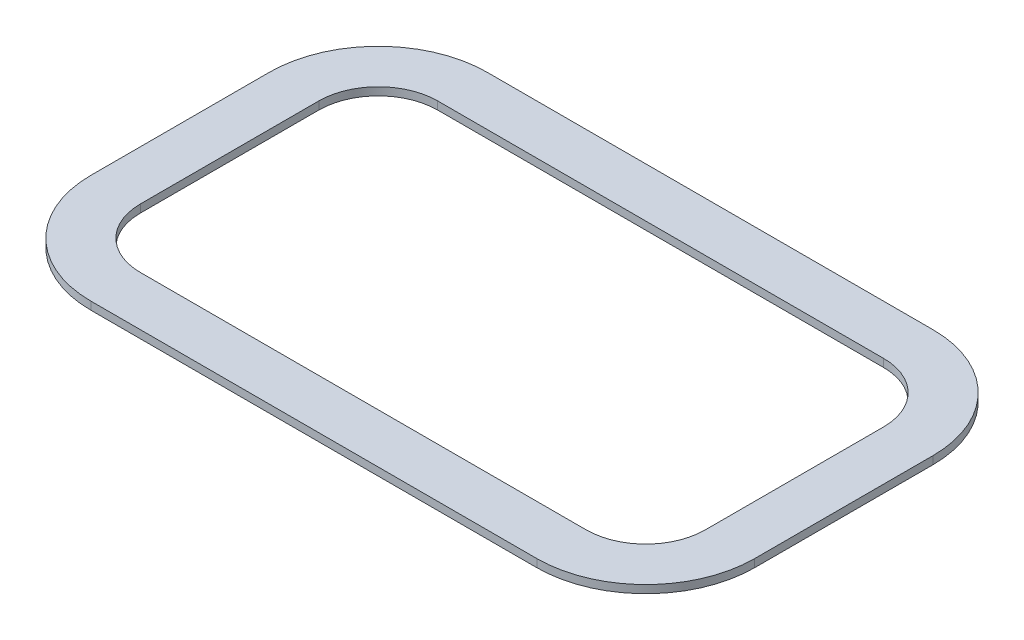
ISO-10303-21;
HEADER;
FILE_DESCRIPTION(('STEP AP214'),'2;1');
FILE_NAME('part.step','',(''),(''),'','','');
FILE_SCHEMA(('AUTOMOTIVE_DESIGN { 1 0 10303 214 1 1 1 1 }'));
ENDSEC;
DATA;
#1=APPLICATION_CONTEXT('core data for automotive mechanical design processes');
#2=APPLICATION_PROTOCOL_DEFINITION('international standard','automotive_design',2000,#1);
#3=PRODUCT_CONTEXT('',#1,'mechanical');
#4=PRODUCT('Part','Part','',(#3));
#5=PRODUCT_RELATED_PRODUCT_CATEGORY('part','',(#4));
#6=PRODUCT_DEFINITION_FORMATION('','',#4);
#7=PRODUCT_DEFINITION_CONTEXT('part definition',#1,'design');
#8=PRODUCT_DEFINITION('design','',#6,#7);
#9=PRODUCT_DEFINITION_SHAPE('','',#8);
#10=(LENGTH_UNIT() NAMED_UNIT(*) SI_UNIT(.MILLI.,.METRE.));
#11=(NAMED_UNIT(*) PLANE_ANGLE_UNIT() SI_UNIT($,.RADIAN.));
#12=(NAMED_UNIT(*) SI_UNIT($,.STERADIAN.) SOLID_ANGLE_UNIT());
#13=UNCERTAINTY_MEASURE_WITH_UNIT(LENGTH_MEASURE(1.E-05),#10,'distance_accuracy_value','');
#14=(GEOMETRIC_REPRESENTATION_CONTEXT(3) GLOBAL_UNCERTAINTY_ASSIGNED_CONTEXT((#13)) GLOBAL_UNIT_ASSIGNED_CONTEXT((#10,
#11,#12)) REPRESENTATION_CONTEXT('',''));
#15=CARTESIAN_POINT('',(0.,0.,0.));
#16=DIRECTION('',(0.,0.,1.));
#17=DIRECTION('',(1.,0.,0.));
#18=AXIS2_PLACEMENT_3D('',#15,#16,#17);
#19=CARTESIAN_POINT('',(55.,4.,-55.));
#20=DIRECTION('',(0.,-1.,0.));
#21=DIRECTION('',(0.,0.,-1.));
#22=AXIS2_PLACEMENT_3D('',#19,#20,#21);
#23=PLANE('',#22);
#24=CARTESIAN_POINT('',(55.,4.,-55.));
#25=DIRECTION('',(0.,1.,0.));
#26=DIRECTION('',(0.,0.,-1.));
#27=AXIS2_PLACEMENT_3D('',#24,#25,#26);
#28=CIRCLE('',#27,55.);
#29=CARTESIAN_POINT('',(0.,4.,-55.0000000000004));
#30=VERTEX_POINT('',#29);
#31=CARTESIAN_POINT('',(55.0000000000004,4.,0.));
#32=VERTEX_POINT('',#31);
#33=EDGE_CURVE('E213',#30,#32,#28,.T.);
#34=ORIENTED_EDGE('',*,*,#33,.T.);
#35=DIRECTION('',(1.,0.,0.));
#36=VECTOR('',#35,1.);
#37=CARTESIAN_POINT('',(55.0000000000004,4.,0.));
#38=LINE('',#37,#36);
#39=CARTESIAN_POINT('',(280.,4.,0.));
#40=VERTEX_POINT('',#39);
#41=EDGE_CURVE('E216',#32,#40,#38,.T.);
#42=ORIENTED_EDGE('',*,*,#41,.T.);
#43=CARTESIAN_POINT('',(280.,4.,-55.));
#44=DIRECTION('',(0.,1.,0.));
#45=DIRECTION('',(0.,0.,1.));
#46=AXIS2_PLACEMENT_3D('',#43,#44,#45);
#47=CIRCLE('',#46,55.);
#48=CARTESIAN_POINT('',(335.,4.,-55.0000000000004));
#49=VERTEX_POINT('',#48);
#50=EDGE_CURVE('E219',#40,#49,#47,.T.);
#51=ORIENTED_EDGE('',*,*,#50,.T.);
#52=DIRECTION('',(0.,0.,-1.));
#53=VECTOR('',#52,1.);
#54=CARTESIAN_POINT('',(335.,4.,-55.0000000000004));
#55=LINE('',#54,#53);
#56=CARTESIAN_POINT('',(335.,4.,-145.));
#57=VERTEX_POINT('',#56);
#58=EDGE_CURVE('E221',#49,#57,#55,.T.);
#59=ORIENTED_EDGE('',*,*,#58,.T.);
#60=CARTESIAN_POINT('',(280.,4.,-145.));
#61=DIRECTION('',(0.,1.,0.));
#62=DIRECTION('',(0.,0.,-1.));
#63=AXIS2_PLACEMENT_3D('',#60,#61,#62);
#64=CIRCLE('',#63,55.);
#65=CARTESIAN_POINT('',(280.,4.,-200.));
#66=VERTEX_POINT('',#65);
#67=EDGE_CURVE('E223',#57,#66,#64,.T.);
#68=ORIENTED_EDGE('',*,*,#67,.T.);
#69=DIRECTION('',(-1.,0.,0.));
#70=VECTOR('',#69,1.);
#71=CARTESIAN_POINT('',(55.0000000000004,4.,-200.));
#72=LINE('',#71,#70);
#73=CARTESIAN_POINT('',(55.0000000000004,4.,-200.));
#74=VERTEX_POINT('',#73);
#75=EDGE_CURVE('E225',#66,#74,#72,.T.);
#76=ORIENTED_EDGE('',*,*,#75,.T.);
#77=CARTESIAN_POINT('',(55.,4.,-145.));
#78=DIRECTION('',(0.,1.,0.));
#79=DIRECTION('',(0.,0.,-1.));
#80=AXIS2_PLACEMENT_3D('',#77,#78,#79);
#81=CIRCLE('',#80,55.);
#82=CARTESIAN_POINT('',(0.,4.,-145.));
#83=VERTEX_POINT('',#82);
#84=EDGE_CURVE('E227',#74,#83,#81,.T.);
#85=ORIENTED_EDGE('',*,*,#84,.T.);
#86=DIRECTION('',(0.,0.,1.));
#87=VECTOR('',#86,1.);
#88=CARTESIAN_POINT('',(0.,4.,-55.0000000000004));
#89=LINE('',#88,#87);
#90=EDGE_CURVE('E229',#83,#30,#89,.T.);
#91=ORIENTED_EDGE('',*,*,#90,.T.);
#92=EDGE_LOOP('',(#34,#42,#51,#59,#68,#76,#85,#91));
#93=FACE_BOUND('',#92,.T.);
#94=CARTESIAN_POINT('',(55.,4.,-55.));
#95=DIRECTION('',(0.,1.,0.));
#96=DIRECTION('',(0.,0.,-1.));
#97=AXIS2_PLACEMENT_3D('',#94,#95,#96);
#98=CIRCLE('',#97,30.);
#99=CARTESIAN_POINT('',(25.,4.,-55.0000000000004));
#100=VERTEX_POINT('',#99);
#101=CARTESIAN_POINT('',(55.0000000000004,4.,-25.));
#102=VERTEX_POINT('',#101);
#103=EDGE_CURVE('E148',#100,#102,#98,.T.);
#104=ORIENTED_EDGE('',*,*,#103,.F.);
#105=DIRECTION('',(0.,0.,1.));
#106=VECTOR('',#105,1.);
#107=CARTESIAN_POINT('',(25.,4.,-55.0000000000004));
#108=LINE('',#107,#106);
#109=CARTESIAN_POINT('',(25.,4.,-145.));
#110=VERTEX_POINT('',#109);
#111=EDGE_CURVE('E181',#110,#100,#108,.T.);
#112=ORIENTED_EDGE('',*,*,#111,.F.);
#113=CARTESIAN_POINT('',(55.,4.,-145.));
#114=DIRECTION('',(0.,1.,0.));
#115=DIRECTION('',(0.,0.,-1.));
#116=AXIS2_PLACEMENT_3D('',#113,#114,#115);
#117=CIRCLE('',#116,30.);
#118=CARTESIAN_POINT('',(55.0000000000004,4.,-175.));
#119=VERTEX_POINT('',#118);
#120=EDGE_CURVE('E179',#119,#110,#117,.T.);
#121=ORIENTED_EDGE('',*,*,#120,.F.);
#122=DIRECTION('',(-1.,0.,0.));
#123=VECTOR('',#122,1.);
#124=CARTESIAN_POINT('',(55.0000000000004,4.,-175.));
#125=LINE('',#124,#123);
#126=CARTESIAN_POINT('',(280.,4.,-175.));
#127=VERTEX_POINT('',#126);
#128=EDGE_CURVE('E177',#127,#119,#125,.T.);
#129=ORIENTED_EDGE('',*,*,#128,.F.);
#130=CARTESIAN_POINT('',(280.,4.,-145.));
#131=DIRECTION('',(0.,1.,0.));
#132=DIRECTION('',(0.,0.,-1.));
#133=AXIS2_PLACEMENT_3D('',#130,#131,#132);
#134=CIRCLE('',#133,30.);
#135=CARTESIAN_POINT('',(310.,4.,-145.));
#136=VERTEX_POINT('',#135);
#137=EDGE_CURVE('E175',#136,#127,#134,.T.);
#138=ORIENTED_EDGE('',*,*,#137,.F.);
#139=DIRECTION('',(0.,0.,-1.));
#140=VECTOR('',#139,1.);
#141=CARTESIAN_POINT('',(310.,4.,-55.0000000000002));
#142=LINE('',#141,#140);
#143=CARTESIAN_POINT('',(310.,4.,-55.0000000000002));
#144=VERTEX_POINT('',#143);
#145=EDGE_CURVE('E171',#144,#136,#142,.T.);
#146=ORIENTED_EDGE('',*,*,#145,.F.);
#147=CARTESIAN_POINT('',(280.,4.,-55.));
#148=DIRECTION('',(0.,1.,0.));
#149=DIRECTION('',(0.,0.,1.));
#150=AXIS2_PLACEMENT_3D('',#147,#148,#149);
#151=CIRCLE('',#150,30.);
#152=CARTESIAN_POINT('',(280.,4.,-25.));
#153=VERTEX_POINT('',#152);
#154=EDGE_CURVE('E169',#153,#144,#151,.T.);
#155=ORIENTED_EDGE('',*,*,#154,.F.);
#156=DIRECTION('',(1.,0.,0.));
#157=VECTOR('',#156,1.);
#158=CARTESIAN_POINT('',(55.0000000000004,4.,-25.));
#159=LINE('',#158,#157);
#160=EDGE_CURVE('E156',#102,#153,#159,.T.);
#161=ORIENTED_EDGE('',*,*,#160,.F.);
#162=EDGE_LOOP('',(#104,#112,#121,#129,#138,#146,#155,#161));
#163=FACE_BOUND('',#162,.T.);
#164=ADVANCED_FACE('F35',(#93,#163),#23,.F.);
#165=CARTESIAN_POINT('',(55.,0.,-55.));
#166=DIRECTION('',(0.,-1.,0.));
#167=DIRECTION('',(0.,0.,-1.));
#168=AXIS2_PLACEMENT_3D('',#165,#166,#167);
#169=PLANE('',#168);
#170=CARTESIAN_POINT('',(55.,0.,-55.));
#171=DIRECTION('',(0.,1.,0.));
#172=DIRECTION('',(0.,0.,-1.));
#173=AXIS2_PLACEMENT_3D('',#170,#171,#172);
#174=CIRCLE('',#173,55.);
#175=CARTESIAN_POINT('',(0.,0.,-55.0000000000004));
#176=VERTEX_POINT('',#175);
#177=CARTESIAN_POINT('',(55.0000000000004,0.,0.));
#178=VERTEX_POINT('',#177);
#179=EDGE_CURVE('E164',#176,#178,#174,.T.);
#180=ORIENTED_EDGE('',*,*,#179,.F.);
#181=DIRECTION('',(0.,0.,1.));
#182=VECTOR('',#181,1.);
#183=CARTESIAN_POINT('',(0.,0.,-55.0000000000004));
#184=LINE('',#183,#182);
#185=CARTESIAN_POINT('',(0.,0.,-145.));
#186=VERTEX_POINT('',#185);
#187=EDGE_CURVE('E217',#186,#176,#184,.T.);
#188=ORIENTED_EDGE('',*,*,#187,.F.);
#189=CARTESIAN_POINT('',(55.,0.,-145.));
#190=DIRECTION('',(0.,1.,0.));
#191=DIRECTION('',(0.,0.,-1.));
#192=AXIS2_PLACEMENT_3D('',#189,#190,#191);
#193=CIRCLE('',#192,55.);
#194=CARTESIAN_POINT('',(55.0000000000004,0.,-200.));
#195=VERTEX_POINT('',#194);
#196=EDGE_CURVE('E244',#195,#186,#193,.T.);
#197=ORIENTED_EDGE('',*,*,#196,.F.);
#198=DIRECTION('',(-1.,0.,0.));
#199=VECTOR('',#198,1.);
#200=CARTESIAN_POINT('',(55.0000000000004,0.,-200.));
#201=LINE('',#200,#199);
#202=CARTESIAN_POINT('',(280.,0.,-200.));
#203=VERTEX_POINT('',#202);
#204=EDGE_CURVE('E242',#203,#195,#201,.T.);
#205=ORIENTED_EDGE('',*,*,#204,.F.);
#206=CARTESIAN_POINT('',(280.,0.,-145.));
#207=DIRECTION('',(0.,1.,0.));
#208=DIRECTION('',(0.,0.,-1.));
#209=AXIS2_PLACEMENT_3D('',#206,#207,#208);
#210=CIRCLE('',#209,55.);
#211=CARTESIAN_POINT('',(335.,0.,-145.));
#212=VERTEX_POINT('',#211);
#213=EDGE_CURVE('E240',#212,#203,#210,.T.);
#214=ORIENTED_EDGE('',*,*,#213,.F.);
#215=DIRECTION('',(0.,0.,-1.));
#216=VECTOR('',#215,1.);
#217=CARTESIAN_POINT('',(335.,0.,-55.0000000000004));
#218=LINE('',#217,#216);
#219=CARTESIAN_POINT('',(335.,0.,-55.0000000000004));
#220=VERTEX_POINT('',#219);
#221=EDGE_CURVE('E238',#220,#212,#218,.T.);
#222=ORIENTED_EDGE('',*,*,#221,.F.);
#223=CARTESIAN_POINT('',(280.,0.,-55.));
#224=DIRECTION('',(0.,1.,0.));
#225=DIRECTION('',(0.,0.,1.));
#226=AXIS2_PLACEMENT_3D('',#223,#224,#225);
#227=CIRCLE('',#226,55.);
#228=CARTESIAN_POINT('',(280.,0.,0.));
#229=VERTEX_POINT('',#228);
#230=EDGE_CURVE('E236',#229,#220,#227,.T.);
#231=ORIENTED_EDGE('',*,*,#230,.F.);
#232=DIRECTION('',(1.,0.,0.));
#233=VECTOR('',#232,1.);
#234=CARTESIAN_POINT('',(55.0000000000004,0.,0.));
#235=LINE('',#234,#233);
#236=EDGE_CURVE('E234',#178,#229,#235,.T.);
#237=ORIENTED_EDGE('',*,*,#236,.F.);
#238=EDGE_LOOP('',(#180,#188,#197,#205,#214,#222,#231,#237));
#239=FACE_BOUND('',#238,.T.);
#240=DIRECTION('',(0.,0.,1.));
#241=VECTOR('',#240,1.);
#242=CARTESIAN_POINT('',(25.,0.,-55.0000000000004));
#243=LINE('',#242,#241);
#244=CARTESIAN_POINT('',(25.,0.,-145.));
#245=VERTEX_POINT('',#244);
#246=CARTESIAN_POINT('',(25.,0.,-55.0000000000004));
#247=VERTEX_POINT('',#246);
#248=EDGE_CURVE('E157',#245,#247,#243,.T.);
#249=ORIENTED_EDGE('',*,*,#248,.T.);
#250=CARTESIAN_POINT('',(55.,0.,-55.));
#251=DIRECTION('',(0.,1.,0.));
#252=DIRECTION('',(0.,0.,-1.));
#253=AXIS2_PLACEMENT_3D('',#250,#251,#252);
#254=CIRCLE('',#253,30.);
#255=CARTESIAN_POINT('',(55.0000000000004,0.,-25.));
#256=VERTEX_POINT('',#255);
#257=EDGE_CURVE('E58',#247,#256,#254,.T.);
#258=ORIENTED_EDGE('',*,*,#257,.T.);
#259=DIRECTION('',(1.,0.,0.));
#260=VECTOR('',#259,1.);
#261=CARTESIAN_POINT('',(55.0000000000004,0.,-25.));
#262=LINE('',#261,#260);
#263=CARTESIAN_POINT('',(280.,0.,-25.));
#264=VERTEX_POINT('',#263);
#265=EDGE_CURVE('E163',#256,#264,#262,.T.);
#266=ORIENTED_EDGE('',*,*,#265,.T.);
#267=CARTESIAN_POINT('',(280.,0.,-55.));
#268=DIRECTION('',(0.,1.,0.));
#269=DIRECTION('',(0.,0.,1.));
#270=AXIS2_PLACEMENT_3D('',#267,#268,#269);
#271=CIRCLE('',#270,30.);
#272=CARTESIAN_POINT('',(310.,0.,-55.0000000000002));
#273=VERTEX_POINT('',#272);
#274=EDGE_CURVE('E185',#264,#273,#271,.T.);
#275=ORIENTED_EDGE('',*,*,#274,.T.);
#276=DIRECTION('',(0.,0.,-1.));
#277=VECTOR('',#276,1.);
#278=CARTESIAN_POINT('',(310.,0.,-55.0000000000002));
#279=LINE('',#278,#277);
#280=CARTESIAN_POINT('',(310.,0.,-145.));
#281=VERTEX_POINT('',#280);
#282=EDGE_CURVE('E188',#273,#281,#279,.T.);
#283=ORIENTED_EDGE('',*,*,#282,.T.);
#284=CARTESIAN_POINT('',(280.,0.,-145.));
#285=DIRECTION('',(0.,1.,0.));
#286=DIRECTION('',(0.,0.,-1.));
#287=AXIS2_PLACEMENT_3D('',#284,#285,#286);
#288=CIRCLE('',#287,30.);
#289=CARTESIAN_POINT('',(280.,0.,-175.));
#290=VERTEX_POINT('',#289);
#291=EDGE_CURVE('E191',#281,#290,#288,.T.);
#292=ORIENTED_EDGE('',*,*,#291,.T.);
#293=DIRECTION('',(-1.,0.,0.));
#294=VECTOR('',#293,1.);
#295=CARTESIAN_POINT('',(55.0000000000004,0.,-175.));
#296=LINE('',#295,#294);
#297=CARTESIAN_POINT('',(55.0000000000004,0.,-175.));
#298=VERTEX_POINT('',#297);
#299=EDGE_CURVE('E194',#290,#298,#296,.T.);
#300=ORIENTED_EDGE('',*,*,#299,.T.);
#301=CARTESIAN_POINT('',(55.,0.,-145.));
#302=DIRECTION('',(0.,1.,0.));
#303=DIRECTION('',(0.,0.,-1.));
#304=AXIS2_PLACEMENT_3D('',#301,#302,#303);
#305=CIRCLE('',#304,30.);
#306=EDGE_CURVE('E197',#298,#245,#305,.T.);
#307=ORIENTED_EDGE('',*,*,#306,.T.);
#308=EDGE_LOOP('',(#249,#258,#266,#275,#283,#292,#300,#307));
#309=FACE_BOUND('',#308,.T.);
#310=ADVANCED_FACE('F274',(#239,#309),#169,.T.);
#311=CARTESIAN_POINT('',(55.,4.,-55.));
#312=DIRECTION('',(0.,-1.,0.));
#313=DIRECTION('',(0.,0.,-1.));
#314=AXIS2_PLACEMENT_3D('',#311,#312,#313);
#315=CYLINDRICAL_SURFACE('',#314,55.);
#316=ORIENTED_EDGE('',*,*,#179,.T.);
#317=DIRECTION('',(0.,-1.,0.));
#318=VECTOR('',#317,1.);
#319=CARTESIAN_POINT('',(55.0000000000004,4.,0.));
#320=LINE('',#319,#318);
#321=EDGE_CURVE('E11',#32,#178,#320,.T.);
#322=ORIENTED_EDGE('',*,*,#321,.F.);
#323=ORIENTED_EDGE('',*,*,#33,.F.);
#324=DIRECTION('',(0.,-1.,0.));
#325=VECTOR('',#324,1.);
#326=CARTESIAN_POINT('',(0.,4.,-55.0000000000004));
#327=LINE('',#326,#325);
#328=EDGE_CURVE('E231',#30,#176,#327,.T.);
#329=ORIENTED_EDGE('',*,*,#328,.T.);
#330=EDGE_LOOP('',(#316,#322,#323,#329));
#331=FACE_BOUND('',#330,.T.);
#332=ADVANCED_FACE('F37',(#331),#315,.T.);
#333=CARTESIAN_POINT('',(55.0000000000004,4.,0.));
#334=DIRECTION('',(0.,0.,-1.));
#335=DIRECTION('',(-1.,0.,0.));
#336=AXIS2_PLACEMENT_3D('',#333,#334,#335);
#337=PLANE('',#336);
#338=ORIENTED_EDGE('',*,*,#236,.T.);
#339=DIRECTION('',(0.,-1.,0.));
#340=VECTOR('',#339,1.);
#341=CARTESIAN_POINT('',(280.,4.,0.));
#342=LINE('',#341,#340);
#343=EDGE_CURVE('E43',#40,#229,#342,.T.);
#344=ORIENTED_EDGE('',*,*,#343,.F.);
#345=ORIENTED_EDGE('',*,*,#41,.F.);
#346=ORIENTED_EDGE('',*,*,#321,.T.);
#347=EDGE_LOOP('',(#338,#344,#345,#346));
#348=FACE_BOUND('',#347,.T.);
#349=ADVANCED_FACE('F291',(#348),#337,.F.);
#350=CARTESIAN_POINT('',(280.,4.,-55.));
#351=DIRECTION('',(0.,-1.,0.));
#352=DIRECTION('',(0.,0.,-1.));
#353=AXIS2_PLACEMENT_3D('',#350,#351,#352);
#354=CYLINDRICAL_SURFACE('',#353,55.);
#355=ORIENTED_EDGE('',*,*,#230,.T.);
#356=DIRECTION('',(0.,-1.,0.));
#357=VECTOR('',#356,1.);
#358=CARTESIAN_POINT('',(335.,4.,-55.0000000000004));
#359=LINE('',#358,#357);
#360=EDGE_CURVE('E261',#49,#220,#359,.T.);
#361=ORIENTED_EDGE('',*,*,#360,.F.);
#362=ORIENTED_EDGE('',*,*,#50,.F.);
#363=ORIENTED_EDGE('',*,*,#343,.T.);
#364=EDGE_LOOP('',(#355,#361,#362,#363));
#365=FACE_BOUND('',#364,.T.);
#366=ADVANCED_FACE('F268',(#365),#354,.T.);
#367=CARTESIAN_POINT('',(335.,4.,-55.0000000000004));
#368=DIRECTION('',(-1.,0.,0.));
#369=DIRECTION('',(0.,0.,1.));
#370=AXIS2_PLACEMENT_3D('',#367,#368,#369);
#371=PLANE('',#370);
#372=ORIENTED_EDGE('',*,*,#221,.T.);
#373=DIRECTION('',(0.,-1.,0.));
#374=VECTOR('',#373,1.);
#375=CARTESIAN_POINT('',(335.,4.,-145.));
#376=LINE('',#375,#374);
#377=EDGE_CURVE('E258',#57,#212,#376,.T.);
#378=ORIENTED_EDGE('',*,*,#377,.F.);
#379=ORIENTED_EDGE('',*,*,#58,.F.);
#380=ORIENTED_EDGE('',*,*,#360,.T.);
#381=EDGE_LOOP('',(#372,#378,#379,#380));
#382=FACE_BOUND('',#381,.T.);
#383=ADVANCED_FACE('F280',(#382),#371,.F.);
#384=CARTESIAN_POINT('',(280.,4.,-145.));
#385=DIRECTION('',(0.,-1.,0.));
#386=DIRECTION('',(0.,0.,-1.));
#387=AXIS2_PLACEMENT_3D('',#384,#385,#386);
#388=CYLINDRICAL_SURFACE('',#387,55.);
#389=ORIENTED_EDGE('',*,*,#213,.T.);
#390=DIRECTION('',(0.,-1.,0.));
#391=VECTOR('',#390,1.);
#392=CARTESIAN_POINT('',(280.,4.,-200.));
#393=LINE('',#392,#391);
#394=EDGE_CURVE('E255',#66,#203,#393,.T.);
#395=ORIENTED_EDGE('',*,*,#394,.F.);
#396=ORIENTED_EDGE('',*,*,#67,.F.);
#397=ORIENTED_EDGE('',*,*,#377,.T.);
#398=EDGE_LOOP('',(#389,#395,#396,#397));
#399=FACE_BOUND('',#398,.T.);
#400=ADVANCED_FACE('F284',(#399),#388,.T.);
#401=CARTESIAN_POINT('',(55.0000000000004,4.,-200.));
#402=DIRECTION('',(0.,0.,1.));
#403=DIRECTION('',(1.,0.,0.));
#404=AXIS2_PLACEMENT_3D('',#401,#402,#403);
#405=PLANE('',#404);
#406=ORIENTED_EDGE('',*,*,#204,.T.);
#407=DIRECTION('',(0.,-1.,0.));
#408=VECTOR('',#407,1.);
#409=CARTESIAN_POINT('',(55.0000000000004,4.,-200.));
#410=LINE('',#409,#408);
#411=EDGE_CURVE('E252',#74,#195,#410,.T.);
#412=ORIENTED_EDGE('',*,*,#411,.F.);
#413=ORIENTED_EDGE('',*,*,#75,.F.);
#414=ORIENTED_EDGE('',*,*,#394,.T.);
#415=EDGE_LOOP('',(#406,#412,#413,#414));
#416=FACE_BOUND('',#415,.T.);
#417=ADVANCED_FACE('F304',(#416),#405,.F.);
#418=CARTESIAN_POINT('',(55.,4.,-145.));
#419=DIRECTION('',(0.,-1.,0.));
#420=DIRECTION('',(0.,0.,-1.));
#421=AXIS2_PLACEMENT_3D('',#418,#419,#420);
#422=CYLINDRICAL_SURFACE('',#421,55.);
#423=ORIENTED_EDGE('',*,*,#196,.T.);
#424=DIRECTION('',(0.,-1.,0.));
#425=VECTOR('',#424,1.);
#426=CARTESIAN_POINT('',(0.,4.,-145.));
#427=LINE('',#426,#425);
#428=EDGE_CURVE('E249',#83,#186,#427,.T.);
#429=ORIENTED_EDGE('',*,*,#428,.F.);
#430=ORIENTED_EDGE('',*,*,#84,.F.);
#431=ORIENTED_EDGE('',*,*,#411,.T.);
#432=EDGE_LOOP('',(#423,#429,#430,#431));
#433=FACE_BOUND('',#432,.T.);
#434=ADVANCED_FACE('F302',(#433),#422,.T.);
#435=CARTESIAN_POINT('',(0.,4.,-55.0000000000004));
#436=DIRECTION('',(1.,0.,0.));
#437=DIRECTION('',(0.,0.,-1.));
#438=AXIS2_PLACEMENT_3D('',#435,#436,#437);
#439=PLANE('',#438);
#440=ORIENTED_EDGE('',*,*,#187,.T.);
#441=ORIENTED_EDGE('',*,*,#328,.F.);
#442=ORIENTED_EDGE('',*,*,#90,.F.);
#443=ORIENTED_EDGE('',*,*,#428,.T.);
#444=EDGE_LOOP('',(#440,#441,#442,#443));
#445=FACE_BOUND('',#444,.T.);
#446=ADVANCED_FACE('F297',(#445),#439,.F.);
#447=CARTESIAN_POINT('',(55.,4.,-55.));
#448=DIRECTION('',(0.,-1.,0.));
#449=DIRECTION('',(0.,0.,-1.));
#450=AXIS2_PLACEMENT_3D('',#447,#448,#449);
#451=CYLINDRICAL_SURFACE('',#450,30.);
#452=ORIENTED_EDGE('',*,*,#257,.F.);
#453=DIRECTION('',(0.,-1.,0.));
#454=VECTOR('',#453,1.);
#455=CARTESIAN_POINT('',(25.,4.,-55.0000000000004));
#456=LINE('',#455,#454);
#457=EDGE_CURVE('E152',#100,#247,#456,.T.);
#458=ORIENTED_EDGE('',*,*,#457,.F.);
#459=ORIENTED_EDGE('',*,*,#103,.T.);
#460=DIRECTION('',(0.,-1.,0.));
#461=VECTOR('',#460,1.);
#462=CARTESIAN_POINT('',(55.0000000000004,4.,-25.));
#463=LINE('',#462,#461);
#464=EDGE_CURVE('E151',#102,#256,#463,.T.);
#465=ORIENTED_EDGE('',*,*,#464,.T.);
#466=EDGE_LOOP('',(#452,#458,#459,#465));
#467=FACE_BOUND('',#466,.T.);
#468=ADVANCED_FACE('F150',(#467),#451,.F.);
#469=CARTESIAN_POINT('',(55.0000000000004,4.,-25.));
#470=DIRECTION('',(0.,0.,-1.));
#471=DIRECTION('',(-1.,0.,0.));
#472=AXIS2_PLACEMENT_3D('',#469,#470,#471);
#473=PLANE('',#472);
#474=ORIENTED_EDGE('',*,*,#265,.F.);
#475=ORIENTED_EDGE('',*,*,#464,.F.);
#476=ORIENTED_EDGE('',*,*,#160,.T.);
#477=DIRECTION('',(0.,-1.,0.));
#478=VECTOR('',#477,1.);
#479=CARTESIAN_POINT('',(280.,4.,-25.));
#480=LINE('',#479,#478);
#481=EDGE_CURVE('E165',#153,#264,#480,.T.);
#482=ORIENTED_EDGE('',*,*,#481,.T.);
#483=EDGE_LOOP('',(#474,#475,#476,#482));
#484=FACE_BOUND('',#483,.T.);
#485=ADVANCED_FACE('F160',(#484),#473,.T.);
#486=CARTESIAN_POINT('',(280.,4.,-55.));
#487=DIRECTION('',(0.,-1.,0.));
#488=DIRECTION('',(0.,0.,-1.));
#489=AXIS2_PLACEMENT_3D('',#486,#487,#488);
#490=CYLINDRICAL_SURFACE('',#489,30.);
#491=ORIENTED_EDGE('',*,*,#274,.F.);
#492=ORIENTED_EDGE('',*,*,#481,.F.);
#493=ORIENTED_EDGE('',*,*,#154,.T.);
#494=DIRECTION('',(0.,-1.,0.));
#495=VECTOR('',#494,1.);
#496=CARTESIAN_POINT('',(310.,4.,-55.0000000000002));
#497=LINE('',#496,#495);
#498=EDGE_CURVE('E210',#144,#273,#497,.T.);
#499=ORIENTED_EDGE('',*,*,#498,.T.);
#500=EDGE_LOOP('',(#491,#492,#493,#499));
#501=FACE_BOUND('',#500,.T.);
#502=ADVANCED_FACE('F329',(#501),#490,.F.);
#503=CARTESIAN_POINT('',(310.,4.,-55.0000000000002));
#504=DIRECTION('',(-1.,0.,0.));
#505=DIRECTION('',(0.,0.,1.));
#506=AXIS2_PLACEMENT_3D('',#503,#504,#505);
#507=PLANE('',#506);
#508=ORIENTED_EDGE('',*,*,#282,.F.);
#509=ORIENTED_EDGE('',*,*,#498,.F.);
#510=ORIENTED_EDGE('',*,*,#145,.T.);
#511=DIRECTION('',(0.,-1.,0.));
#512=VECTOR('',#511,1.);
#513=CARTESIAN_POINT('',(310.,4.,-145.));
#514=LINE('',#513,#512);
#515=EDGE_CURVE('E208',#136,#281,#514,.T.);
#516=ORIENTED_EDGE('',*,*,#515,.T.);
#517=EDGE_LOOP('',(#508,#509,#510,#516));
#518=FACE_BOUND('',#517,.T.);
#519=ADVANCED_FACE('F333',(#518),#507,.T.);
#520=CARTESIAN_POINT('',(280.,4.,-145.));
#521=DIRECTION('',(0.,-1.,0.));
#522=DIRECTION('',(0.,0.,-1.));
#523=AXIS2_PLACEMENT_3D('',#520,#521,#522);
#524=CYLINDRICAL_SURFACE('',#523,30.);
#525=ORIENTED_EDGE('',*,*,#291,.F.);
#526=ORIENTED_EDGE('',*,*,#515,.F.);
#527=ORIENTED_EDGE('',*,*,#137,.T.);
#528=DIRECTION('',(0.,-1.,0.));
#529=VECTOR('',#528,1.);
#530=CARTESIAN_POINT('',(280.,4.,-175.));
#531=LINE('',#530,#529);
#532=EDGE_CURVE('E206',#127,#290,#531,.T.);
#533=ORIENTED_EDGE('',*,*,#532,.T.);
#534=EDGE_LOOP('',(#525,#526,#527,#533));
#535=FACE_BOUND('',#534,.T.);
#536=ADVANCED_FACE('F339',(#535),#524,.F.);
#537=CARTESIAN_POINT('',(55.0000000000004,4.,-175.));
#538=DIRECTION('',(0.,0.,1.));
#539=DIRECTION('',(1.,0.,0.));
#540=AXIS2_PLACEMENT_3D('',#537,#538,#539);
#541=PLANE('',#540);
#542=ORIENTED_EDGE('',*,*,#299,.F.);
#543=ORIENTED_EDGE('',*,*,#532,.F.);
#544=ORIENTED_EDGE('',*,*,#128,.T.);
#545=DIRECTION('',(0.,-1.,0.));
#546=VECTOR('',#545,1.);
#547=CARTESIAN_POINT('',(55.0000000000004,4.,-175.));
#548=LINE('',#547,#546);
#549=EDGE_CURVE('E204',#119,#298,#548,.T.);
#550=ORIENTED_EDGE('',*,*,#549,.T.);
#551=EDGE_LOOP('',(#542,#543,#544,#550));
#552=FACE_BOUND('',#551,.T.);
#553=ADVANCED_FACE('F343',(#552),#541,.T.);
#554=CARTESIAN_POINT('',(55.,4.,-145.));
#555=DIRECTION('',(0.,-1.,0.));
#556=DIRECTION('',(0.,0.,-1.));
#557=AXIS2_PLACEMENT_3D('',#554,#555,#556);
#558=CYLINDRICAL_SURFACE('',#557,30.);
#559=ORIENTED_EDGE('',*,*,#306,.F.);
#560=ORIENTED_EDGE('',*,*,#549,.F.);
#561=ORIENTED_EDGE('',*,*,#120,.T.);
#562=DIRECTION('',(0.,-1.,0.));
#563=VECTOR('',#562,1.);
#564=CARTESIAN_POINT('',(25.,4.,-145.));
#565=LINE('',#564,#563);
#566=EDGE_CURVE('E50',#110,#245,#565,.T.);
#567=ORIENTED_EDGE('',*,*,#566,.T.);
#568=EDGE_LOOP('',(#559,#560,#561,#567));
#569=FACE_BOUND('',#568,.T.);
#570=ADVANCED_FACE('F347',(#569),#558,.F.);
#571=CARTESIAN_POINT('',(25.,4.,-55.0000000000004));
#572=DIRECTION('',(1.,0.,0.));
#573=DIRECTION('',(0.,0.,-1.));
#574=AXIS2_PLACEMENT_3D('',#571,#572,#573);
#575=PLANE('',#574);
#576=ORIENTED_EDGE('',*,*,#248,.F.);
#577=ORIENTED_EDGE('',*,*,#566,.F.);
#578=ORIENTED_EDGE('',*,*,#111,.T.);
#579=ORIENTED_EDGE('',*,*,#457,.T.);
#580=EDGE_LOOP('',(#576,#577,#578,#579));
#581=FACE_BOUND('',#580,.T.);
#582=ADVANCED_FACE('F351',(#581),#575,.T.);
#583=CLOSED_SHELL('',(#164,#310,#332,#349,#366,#383,#400,#417,#434,#446,#468,#485,#502,#519,
#536,#553,#570,#582));
#584=MANIFOLD_SOLID_BREP('B2',#583);
#585=ADVANCED_BREP_SHAPE_REPRESENTATION('',(#18,#584),#14);
#586=SHAPE_DEFINITION_REPRESENTATION(#9,#585);
ENDSEC;
END-ISO-10303-21;
